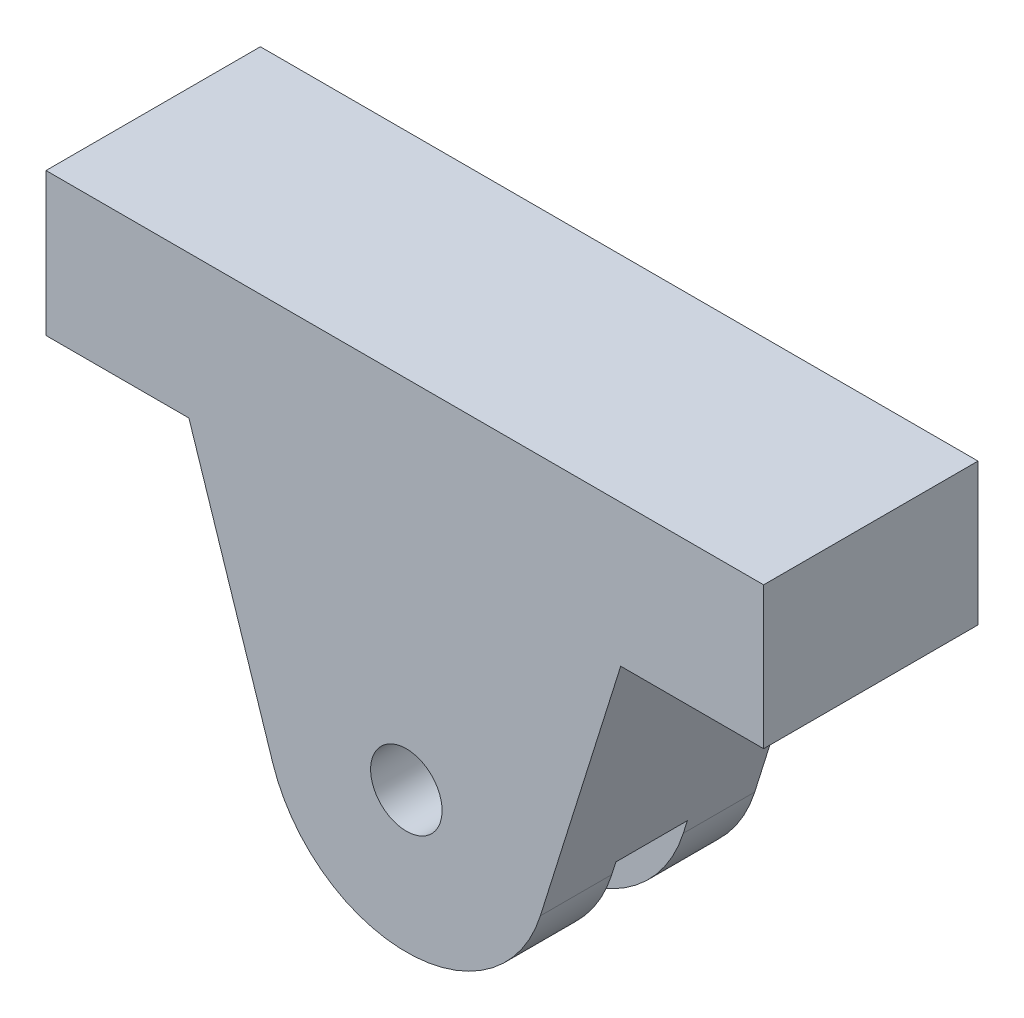
ISO-10303-21;
HEADER;
FILE_DESCRIPTION(('STEP AP214'),'2;1');
FILE_NAME('part.step','',(''),(''),'','','');
FILE_SCHEMA(('AUTOMOTIVE_DESIGN { 1 0 10303 214 1 1 1 1 }'));
ENDSEC;
DATA;
#1=APPLICATION_CONTEXT('core data for automotive mechanical design processes');
#2=APPLICATION_PROTOCOL_DEFINITION('international standard','automotive_design',2000,#1);
#3=PRODUCT_CONTEXT('',#1,'mechanical');
#4=PRODUCT('Part','Part','',(#3));
#5=PRODUCT_RELATED_PRODUCT_CATEGORY('part','',(#4));
#6=PRODUCT_DEFINITION_FORMATION('','',#4);
#7=PRODUCT_DEFINITION_CONTEXT('part definition',#1,'design');
#8=PRODUCT_DEFINITION('design','',#6,#7);
#9=PRODUCT_DEFINITION_SHAPE('','',#8);
#10=(LENGTH_UNIT() NAMED_UNIT(*) SI_UNIT(.MILLI.,.METRE.));
#11=(NAMED_UNIT(*) PLANE_ANGLE_UNIT() SI_UNIT($,.RADIAN.));
#12=(NAMED_UNIT(*) SI_UNIT($,.STERADIAN.) SOLID_ANGLE_UNIT());
#13=UNCERTAINTY_MEASURE_WITH_UNIT(LENGTH_MEASURE(1.E-05),#10,'distance_accuracy_value','');
#14=(GEOMETRIC_REPRESENTATION_CONTEXT(3) GLOBAL_UNCERTAINTY_ASSIGNED_CONTEXT((#13)) GLOBAL_UNIT_ASSIGNED_CONTEXT((#10,
#11,#12)) REPRESENTATION_CONTEXT('',''));
#15=CARTESIAN_POINT('',(0.,0.,0.));
#16=DIRECTION('',(0.,0.,1.));
#17=DIRECTION('',(1.,0.,0.));
#18=AXIS2_PLACEMENT_3D('',#15,#16,#17);
#19=CARTESIAN_POINT('',(-30.,20.,15.));
#20=DIRECTION('',(0.950602098614549,0.310412065019412,0.));
#21=DIRECTION('',(-0.310412065019412,0.950602098614549,0.));
#22=AXIS2_PLACEMENT_3D('',#19,#20,#21);
#23=PLANE('',#22);
#24=DIRECTION('',(0.310412065019412,-0.950602098614549,0.));
#25=VECTOR('',#24,1.);
#26=CARTESIAN_POINT('',(-30.,20.,-5.));
#27=LINE('',#26,#25);
#28=CARTESIAN_POINT('',(-19.1357062765585,-13.2706797747133,-5.));
#29=VERTEX_POINT('',#28);
#30=CARTESIAN_POINT('',(-18.2569796834297,-15.9616813099934,-5.));
#31=VERTEX_POINT('',#30);
#32=EDGE_CURVE('E244',#29,#31,#27,.T.);
#33=ORIENTED_EDGE('',*,*,#32,.F.);
#34=DIRECTION('',(0.,0.,1.));
#35=VECTOR('',#34,1.);
#36=CARTESIAN_POINT('',(-19.1357062765585,-13.2706797747133,15.));
#37=LINE('',#36,#35);
#38=CARTESIAN_POINT('',(-19.1357062765585,-13.2706797747133,5.));
#39=VERTEX_POINT('',#38);
#40=EDGE_CURVE('E11',#29,#39,#37,.T.);
#41=ORIENTED_EDGE('',*,*,#40,.T.);
#42=DIRECTION('',(0.310412065019412,-0.950602098614549,0.));
#43=VECTOR('',#42,1.);
#44=CARTESIAN_POINT('',(-30.,20.,5.));
#45=LINE('',#44,#43);
#46=CARTESIAN_POINT('',(-18.2569796834297,-15.9616813099934,5.));
#47=VERTEX_POINT('',#46);
#48=EDGE_CURVE('E192',#39,#47,#45,.T.);
#49=ORIENTED_EDGE('',*,*,#48,.T.);
#50=DIRECTION('',(0.,0.,-1.));
#51=VECTOR('',#50,1.);
#52=CARTESIAN_POINT('',(-18.2569796834297,-15.9616813099934,15.));
#53=LINE('',#52,#51);
#54=CARTESIAN_POINT('',(-18.2569796834297,-15.9616813099934,15.));
#55=VERTEX_POINT('',#54);
#56=EDGE_CURVE('E176',#55,#47,#53,.T.);
#57=ORIENTED_EDGE('',*,*,#56,.F.);
#58=DIRECTION('',(0.310412065019412,-0.950602098614549,0.));
#59=VECTOR('',#58,1.);
#60=CARTESIAN_POINT('',(-30.,20.,15.));
#61=LINE('',#60,#59);
#62=CARTESIAN_POINT('',(-30.,20.,15.));
#63=VERTEX_POINT('',#62);
#64=EDGE_CURVE('E254',#63,#55,#61,.T.);
#65=ORIENTED_EDGE('',*,*,#64,.F.);
#66=DIRECTION('',(0.,0.,-1.));
#67=VECTOR('',#66,1.);
#68=CARTESIAN_POINT('',(-30.,20.,15.));
#69=LINE('',#68,#67);
#70=CARTESIAN_POINT('',(-30.,20.,-15.));
#71=VERTEX_POINT('',#70);
#72=EDGE_CURVE('E179',#63,#71,#69,.T.);
#73=ORIENTED_EDGE('',*,*,#72,.T.);
#74=DIRECTION('',(0.310412065019412,-0.950602098614549,0.));
#75=VECTOR('',#74,1.);
#76=CARTESIAN_POINT('',(-30.,20.,-15.));
#77=LINE('',#76,#75);
#78=CARTESIAN_POINT('',(-18.2569796834297,-15.9616813099934,-15.));
#79=VERTEX_POINT('',#78);
#80=EDGE_CURVE('E155',#71,#79,#77,.T.);
#81=ORIENTED_EDGE('',*,*,#80,.T.);
#82=EDGE_CURVE('E175',#31,#79,#53,.T.);
#83=ORIENTED_EDGE('',*,*,#82,.F.);
#84=EDGE_LOOP('',(#33,#41,#49,#57,#65,#73,#81,#83));
#85=FACE_BOUND('',#84,.T.);
#86=ADVANCED_FACE('F39',(#85),#23,.F.);
#87=CARTESIAN_POINT('',(0.426111358182474,-9.86085649630437,15.));
#88=DIRECTION('',(0.,0.,-1.));
#89=DIRECTION('',(-1.,0.,0.));
#90=AXIS2_PLACEMENT_3D('',#87,#88,#89);
#91=CYLINDRICAL_SURFACE('',#90,19.653955181502);
#92=CARTESIAN_POINT('',(0.426111358182474,-9.86085649630437,-5.));
#93=DIRECTION('',(0.,0.,1.));
#94=DIRECTION('',(1.,0.,0.));
#95=AXIS2_PLACEMENT_3D('',#92,#93,#94);
#96=CIRCLE('',#95,19.653955181502);
#97=CARTESIAN_POINT('',(19.1803905159256,-15.7392038448311,-5.));
#98=VERTEX_POINT('',#97);
#99=EDGE_CURVE('E241',#31,#98,#96,.T.);
#100=ORIENTED_EDGE('',*,*,#99,.F.);
#101=ORIENTED_EDGE('',*,*,#82,.T.);
#102=CARTESIAN_POINT('',(0.426111358182474,-9.86085649630437,-15.));
#103=DIRECTION('',(0.,0.,1.));
#104=DIRECTION('',(1.,0.,0.));
#105=AXIS2_PLACEMENT_3D('',#102,#103,#104);
#106=CIRCLE('',#105,19.653955181502);
#107=CARTESIAN_POINT('',(19.1803905159256,-15.7392038448311,-15.));
#108=VERTEX_POINT('',#107);
#109=EDGE_CURVE('E158',#79,#108,#106,.T.);
#110=ORIENTED_EDGE('',*,*,#109,.T.);
#111=DIRECTION('',(0.,0.,-1.));
#112=VECTOR('',#111,1.);
#113=CARTESIAN_POINT('',(19.1803905159256,-15.7392038448311,15.));
#114=LINE('',#113,#112);
#115=EDGE_CURVE('E171',#98,#108,#114,.T.);
#116=ORIENTED_EDGE('',*,*,#115,.F.);
#117=EDGE_LOOP('',(#100,#101,#110,#116));
#118=FACE_BOUND('',#117,.T.);
#119=ADVANCED_FACE('F292',(#118),#91,.T.);
#120=CARTESIAN_POINT('',(30.4261113581825,20.1391435036956,15.));
#121=DIRECTION('',(-0.954224174449851,0.299092335066449,0.));
#122=DIRECTION('',(-0.299092335066449,-0.954224174449851,0.));
#123=AXIS2_PLACEMENT_3D('',#120,#121,#122);
#124=PLANE('',#123);
#125=DIRECTION('',(0.299092335066449,0.954224174449851,0.));
#126=VECTOR('',#125,1.);
#127=CARTESIAN_POINT('',(30.4261113581825,20.1391435036956,-5.));
#128=LINE('',#127,#126);
#129=CARTESIAN_POINT('',(19.7490598086974,-13.9249213547446,-5.));
#130=VERTEX_POINT('',#129);
#131=EDGE_CURVE('E191',#98,#130,#128,.T.);
#132=ORIENTED_EDGE('',*,*,#131,.F.);
#133=ORIENTED_EDGE('',*,*,#115,.T.);
#134=DIRECTION('',(0.299092335066449,0.954224174449851,0.));
#135=VECTOR('',#134,1.);
#136=CARTESIAN_POINT('',(30.4261113581825,20.1391435036956,-15.));
#137=LINE('',#136,#135);
#138=CARTESIAN_POINT('',(30.4261113581825,20.1391435036956,-15.));
#139=VERTEX_POINT('',#138);
#140=EDGE_CURVE('E161',#108,#139,#137,.T.);
#141=ORIENTED_EDGE('',*,*,#140,.T.);
#142=DIRECTION('',(0.,0.,-1.));
#143=VECTOR('',#142,1.);
#144=CARTESIAN_POINT('',(30.4261113581825,20.1391435036956,15.));
#145=LINE('',#144,#143);
#146=CARTESIAN_POINT('',(30.4261113581825,20.1391435036956,15.));
#147=VERTEX_POINT('',#146);
#148=EDGE_CURVE('E140',#147,#139,#145,.T.);
#149=ORIENTED_EDGE('',*,*,#148,.F.);
#150=DIRECTION('',(0.299092335066449,0.954224174449851,0.));
#151=VECTOR('',#150,1.);
#152=CARTESIAN_POINT('',(30.4261113581825,20.1391435036956,15.));
#153=LINE('',#152,#151);
#154=CARTESIAN_POINT('',(19.1803905159256,-15.7392038448311,15.));
#155=VERTEX_POINT('',#154);
#156=EDGE_CURVE('E128',#155,#147,#153,.T.);
#157=ORIENTED_EDGE('',*,*,#156,.F.);
#158=CARTESIAN_POINT('',(19.1803905159256,-15.7392038448311,5.));
#159=VERTEX_POINT('',#158);
#160=EDGE_CURVE('E172',#155,#159,#114,.T.);
#161=ORIENTED_EDGE('',*,*,#160,.T.);
#162=DIRECTION('',(0.299092335066449,0.954224174449851,0.));
#163=VECTOR('',#162,1.);
#164=CARTESIAN_POINT('',(30.4261113581825,20.1391435036956,5.));
#165=LINE('',#164,#163);
#166=CARTESIAN_POINT('',(19.7490598086974,-13.9249213547446,5.));
#167=VERTEX_POINT('',#166);
#168=EDGE_CURVE('E187',#159,#167,#165,.T.);
#169=ORIENTED_EDGE('',*,*,#168,.T.);
#170=DIRECTION('',(0.,0.,-1.));
#171=VECTOR('',#170,1.);
#172=CARTESIAN_POINT('',(19.7490598086974,-13.9249213547446,15.));
#173=LINE('',#172,#171);
#174=EDGE_CURVE('E47',#167,#130,#173,.T.);
#175=ORIENTED_EDGE('',*,*,#174,.T.);
#176=EDGE_LOOP('',(#132,#133,#141,#149,#157,#161,#169,#175));
#177=FACE_BOUND('',#176,.T.);
#178=ADVANCED_FACE('F198',(#177),#124,.F.);
#179=CARTESIAN_POINT('',(0.426111358182474,-9.86085649630437,15.));
#180=DIRECTION('',(0.,0.,-1.));
#181=DIRECTION('',(-1.,0.,0.));
#182=AXIS2_PLACEMENT_3D('',#179,#180,#181);
#183=CYLINDRICAL_SURFACE('',#182,5.);
#184=CARTESIAN_POINT('',(0.426111358182474,-9.86085649630437,-15.));
#185=DIRECTION('',(0.,0.,1.));
#186=DIRECTION('',(1.,0.,0.));
#187=AXIS2_PLACEMENT_3D('',#184,#185,#186);
#188=CIRCLE('',#187,5.);
#189=CARTESIAN_POINT('',(5.42611135818247,-9.86085649630437,-15.));
#190=VERTEX_POINT('',#189);
#191=EDGE_CURVE('E247',#190,#190,#188,.T.);
#192=ORIENTED_EDGE('',*,*,#191,.F.);
#193=EDGE_LOOP('',(#192));
#194=FACE_BOUND('',#193,.T.);
#195=CARTESIAN_POINT('',(0.426111358182474,-9.86085649630437,-5.));
#196=DIRECTION('',(0.,0.,1.));
#197=DIRECTION('',(1.,0.,0.));
#198=AXIS2_PLACEMENT_3D('',#195,#196,#197);
#199=CIRCLE('',#198,5.);
#200=CARTESIAN_POINT('',(5.42611135818247,-9.86085649630437,-5.));
#201=VERTEX_POINT('',#200);
#202=EDGE_CURVE('E189',#201,#201,#199,.T.);
#203=ORIENTED_EDGE('',*,*,#202,.T.);
#204=EDGE_LOOP('',(#203));
#205=FACE_BOUND('',#204,.T.);
#206=ADVANCED_FACE('F299',(#194,#205),#183,.F.);
#207=CARTESIAN_POINT('',(0.426111358182474,-9.86085649630437,15.));
#208=DIRECTION('',(0.,0.,1.));
#209=DIRECTION('',(1.,0.,0.));
#210=AXIS2_PLACEMENT_3D('',#207,#208,#209);
#211=PLANE('',#210);
#212=DIRECTION('',(0.,-1.,0.));
#213=VECTOR('',#212,1.);
#214=CARTESIAN_POINT('',(-50.,40.,15.));
#215=LINE('',#214,#213);
#216=CARTESIAN_POINT('',(-50.,40.,15.));
#217=VERTEX_POINT('',#216);
#218=CARTESIAN_POINT('',(-50.,20.,15.));
#219=VERTEX_POINT('',#218);
#220=EDGE_CURVE('E167',#217,#219,#215,.T.);
#221=ORIENTED_EDGE('',*,*,#220,.T.);
#222=DIRECTION('',(1.,0.,0.));
#223=VECTOR('',#222,1.);
#224=CARTESIAN_POINT('',(-50.,20.,15.));
#225=LINE('',#224,#223);
#226=EDGE_CURVE('E105',#219,#63,#225,.T.);
#227=ORIENTED_EDGE('',*,*,#226,.T.);
#228=ORIENTED_EDGE('',*,*,#64,.T.);
#229=CARTESIAN_POINT('',(0.426111358182474,-9.86085649630437,15.));
#230=DIRECTION('',(0.,0.,1.));
#231=DIRECTION('',(1.,0.,0.));
#232=AXIS2_PLACEMENT_3D('',#229,#230,#231);
#233=CIRCLE('',#232,19.653955181502);
#234=EDGE_CURVE('E256',#55,#155,#233,.T.);
#235=ORIENTED_EDGE('',*,*,#234,.T.);
#236=ORIENTED_EDGE('',*,*,#156,.T.);
#237=DIRECTION('',(1.,0.,0.));
#238=VECTOR('',#237,1.);
#239=CARTESIAN_POINT('',(50.4261113581825,20.1391435036956,15.));
#240=LINE('',#239,#238);
#241=CARTESIAN_POINT('',(50.4261113581825,20.1391435036956,15.));
#242=VERTEX_POINT('',#241);
#243=EDGE_CURVE('E120',#147,#242,#240,.T.);
#244=ORIENTED_EDGE('',*,*,#243,.T.);
#245=DIRECTION('',(0.,1.,0.));
#246=VECTOR('',#245,1.);
#247=CARTESIAN_POINT('',(50.4261113581825,40.,15.));
#248=LINE('',#247,#246);
#249=CARTESIAN_POINT('',(50.4261113581825,40.,15.));
#250=VERTEX_POINT('',#249);
#251=EDGE_CURVE('E125',#242,#250,#248,.T.);
#252=ORIENTED_EDGE('',*,*,#251,.T.);
#253=DIRECTION('',(-1.,0.,0.));
#254=VECTOR('',#253,1.);
#255=CARTESIAN_POINT('',(-50.,40.,15.));
#256=LINE('',#255,#254);
#257=EDGE_CURVE('E63',#250,#217,#256,.T.);
#258=ORIENTED_EDGE('',*,*,#257,.T.);
#259=EDGE_LOOP('',(#221,#227,#228,#235,#236,#244,#252,#258));
#260=FACE_BOUND('',#259,.T.);
#261=CARTESIAN_POINT('',(0.426111358182474,-9.86085649630437,15.));
#262=DIRECTION('',(0.,0.,1.));
#263=DIRECTION('',(1.,0.,0.));
#264=AXIS2_PLACEMENT_3D('',#261,#262,#263);
#265=CIRCLE('',#264,5.);
#266=CARTESIAN_POINT('',(5.42611135818247,-9.86085649630437,15.));
#267=VERTEX_POINT('',#266);
#268=EDGE_CURVE('E153',#267,#267,#265,.T.);
#269=ORIENTED_EDGE('',*,*,#268,.F.);
#270=EDGE_LOOP('',(#269));
#271=FACE_BOUND('',#270,.T.);
#272=ADVANCED_FACE('F122',(#260,#271),#211,.T.);
#273=CARTESIAN_POINT('',(0.426111358182474,-9.86085649630437,-15.));
#274=DIRECTION('',(0.,0.,1.));
#275=DIRECTION('',(1.,0.,0.));
#276=AXIS2_PLACEMENT_3D('',#273,#274,#275);
#277=PLANE('',#276);
#278=DIRECTION('',(0.,-1.,0.));
#279=VECTOR('',#278,1.);
#280=CARTESIAN_POINT('',(-50.,40.,-15.));
#281=LINE('',#280,#279);
#282=CARTESIAN_POINT('',(-50.,40.,-15.));
#283=VERTEX_POINT('',#282);
#284=CARTESIAN_POINT('',(-50.,20.,-15.));
#285=VERTEX_POINT('',#284);
#286=EDGE_CURVE('E149',#283,#285,#281,.T.);
#287=ORIENTED_EDGE('',*,*,#286,.F.);
#288=DIRECTION('',(-1.,0.,0.));
#289=VECTOR('',#288,1.);
#290=CARTESIAN_POINT('',(-50.,40.,-15.));
#291=LINE('',#290,#289);
#292=CARTESIAN_POINT('',(50.4261113581825,40.,-15.));
#293=VERTEX_POINT('',#292);
#294=EDGE_CURVE('E96',#293,#283,#291,.T.);
#295=ORIENTED_EDGE('',*,*,#294,.F.);
#296=DIRECTION('',(0.,1.,0.));
#297=VECTOR('',#296,1.);
#298=CARTESIAN_POINT('',(50.4261113581825,40.,-15.));
#299=LINE('',#298,#297);
#300=CARTESIAN_POINT('',(50.4261113581825,20.1391435036956,-15.));
#301=VERTEX_POINT('',#300);
#302=EDGE_CURVE('E164',#301,#293,#299,.T.);
#303=ORIENTED_EDGE('',*,*,#302,.F.);
#304=DIRECTION('',(1.,0.,0.));
#305=VECTOR('',#304,1.);
#306=CARTESIAN_POINT('',(50.4261113581825,20.1391435036956,-15.));
#307=LINE('',#306,#305);
#308=EDGE_CURVE('E137',#139,#301,#307,.T.);
#309=ORIENTED_EDGE('',*,*,#308,.F.);
#310=ORIENTED_EDGE('',*,*,#140,.F.);
#311=ORIENTED_EDGE('',*,*,#109,.F.);
#312=ORIENTED_EDGE('',*,*,#80,.F.);
#313=DIRECTION('',(1.,0.,0.));
#314=VECTOR('',#313,1.);
#315=CARTESIAN_POINT('',(-50.,20.,-15.));
#316=LINE('',#315,#314);
#317=EDGE_CURVE('E152',#285,#71,#316,.T.);
#318=ORIENTED_EDGE('',*,*,#317,.F.);
#319=EDGE_LOOP('',(#287,#295,#303,#309,#310,#311,#312,#318));
#320=FACE_BOUND('',#319,.T.);
#321=ORIENTED_EDGE('',*,*,#191,.T.);
#322=EDGE_LOOP('',(#321));
#323=FACE_BOUND('',#322,.T.);
#324=ADVANCED_FACE('F268',(#320,#323),#277,.F.);
#325=CARTESIAN_POINT('',(-50.,40.,15.));
#326=DIRECTION('',(1.,0.,0.));
#327=DIRECTION('',(0.,1.,0.));
#328=AXIS2_PLACEMENT_3D('',#325,#326,#327);
#329=PLANE('',#328);
#330=ORIENTED_EDGE('',*,*,#286,.T.);
#331=DIRECTION('',(0.,0.,-1.));
#332=VECTOR('',#331,1.);
#333=CARTESIAN_POINT('',(-50.,20.,15.));
#334=LINE('',#333,#332);
#335=EDGE_CURVE('E182',#219,#285,#334,.T.);
#336=ORIENTED_EDGE('',*,*,#335,.F.);
#337=ORIENTED_EDGE('',*,*,#220,.F.);
#338=DIRECTION('',(0.,0.,-1.));
#339=VECTOR('',#338,1.);
#340=CARTESIAN_POINT('',(-50.,40.,15.));
#341=LINE('',#340,#339);
#342=EDGE_CURVE('E145',#217,#283,#341,.T.);
#343=ORIENTED_EDGE('',*,*,#342,.T.);
#344=EDGE_LOOP('',(#330,#336,#337,#343));
#345=FACE_BOUND('',#344,.T.);
#346=ADVANCED_FACE('F41',(#345),#329,.F.);
#347=CARTESIAN_POINT('',(-50.,20.,15.));
#348=DIRECTION('',(0.,1.,0.));
#349=DIRECTION('',(0.,0.,1.));
#350=AXIS2_PLACEMENT_3D('',#347,#348,#349);
#351=PLANE('',#350);
#352=ORIENTED_EDGE('',*,*,#317,.T.);
#353=ORIENTED_EDGE('',*,*,#72,.F.);
#354=ORIENTED_EDGE('',*,*,#226,.F.);
#355=ORIENTED_EDGE('',*,*,#335,.T.);
#356=EDGE_LOOP('',(#352,#353,#354,#355));
#357=FACE_BOUND('',#356,.T.);
#358=ADVANCED_FACE('F275',(#357),#351,.F.);
#359=ORIENTED_EDGE('',*,*,#56,.T.);
#360=CARTESIAN_POINT('',(0.426111358182474,-9.86085649630437,5.));
#361=DIRECTION('',(0.,0.,1.));
#362=DIRECTION('',(1.,0.,0.));
#363=AXIS2_PLACEMENT_3D('',#360,#361,#362);
#364=CIRCLE('',#363,19.653955181502);
#365=EDGE_CURVE('E235',#47,#159,#364,.T.);
#366=ORIENTED_EDGE('',*,*,#365,.T.);
#367=ORIENTED_EDGE('',*,*,#160,.F.);
#368=ORIENTED_EDGE('',*,*,#234,.F.);
#369=EDGE_LOOP('',(#359,#366,#367,#368));
#370=FACE_BOUND('',#369,.T.);
#371=ADVANCED_FACE('F262',(#370),#91,.T.);
#372=CARTESIAN_POINT('',(50.4261113581825,20.1391435036956,15.));
#373=DIRECTION('',(0.,1.,0.));
#374=DIRECTION('',(-1.,0.,0.));
#375=AXIS2_PLACEMENT_3D('',#372,#373,#374);
#376=PLANE('',#375);
#377=ORIENTED_EDGE('',*,*,#308,.T.);
#378=DIRECTION('',(0.,0.,-1.));
#379=VECTOR('',#378,1.);
#380=CARTESIAN_POINT('',(50.4261113581825,20.1391435036956,15.));
#381=LINE('',#380,#379);
#382=EDGE_CURVE('E134',#242,#301,#381,.T.);
#383=ORIENTED_EDGE('',*,*,#382,.F.);
#384=ORIENTED_EDGE('',*,*,#243,.F.);
#385=ORIENTED_EDGE('',*,*,#148,.T.);
#386=EDGE_LOOP('',(#377,#383,#384,#385));
#387=FACE_BOUND('',#386,.T.);
#388=ADVANCED_FACE('F135',(#387),#376,.F.);
#389=CARTESIAN_POINT('',(50.4261113581825,40.,15.));
#390=DIRECTION('',(-1.,0.,0.));
#391=DIRECTION('',(0.,0.,1.));
#392=AXIS2_PLACEMENT_3D('',#389,#390,#391);
#393=PLANE('',#392);
#394=ORIENTED_EDGE('',*,*,#302,.T.);
#395=DIRECTION('',(0.,0.,-1.));
#396=VECTOR('',#395,1.);
#397=CARTESIAN_POINT('',(50.4261113581825,40.,15.));
#398=LINE('',#397,#396);
#399=EDGE_CURVE('E141',#250,#293,#398,.T.);
#400=ORIENTED_EDGE('',*,*,#399,.F.);
#401=ORIENTED_EDGE('',*,*,#251,.F.);
#402=ORIENTED_EDGE('',*,*,#382,.T.);
#403=EDGE_LOOP('',(#394,#400,#401,#402));
#404=FACE_BOUND('',#403,.T.);
#405=ADVANCED_FACE('F143',(#404),#393,.F.);
#406=CARTESIAN_POINT('',(-50.,40.,15.));
#407=DIRECTION('',(0.,-1.,0.));
#408=DIRECTION('',(0.,0.,-1.));
#409=AXIS2_PLACEMENT_3D('',#406,#407,#408);
#410=PLANE('',#409);
#411=ORIENTED_EDGE('',*,*,#294,.T.);
#412=ORIENTED_EDGE('',*,*,#342,.F.);
#413=ORIENTED_EDGE('',*,*,#257,.F.);
#414=ORIENTED_EDGE('',*,*,#399,.T.);
#415=EDGE_LOOP('',(#411,#412,#413,#414));
#416=FACE_BOUND('',#415,.T.);
#417=ADVANCED_FACE('F271',(#416),#410,.F.);
#418=CARTESIAN_POINT('',(0.426111358182474,-9.86085649630437,5.));
#419=DIRECTION('',(0.,0.,1.));
#420=DIRECTION('',(1.,0.,0.));
#421=AXIS2_PLACEMENT_3D('',#418,#419,#420);
#422=CIRCLE('',#421,5.);
#423=CARTESIAN_POINT('',(5.42611135818247,-9.86085649630437,5.));
#424=VERTEX_POINT('',#423);
#425=EDGE_CURVE('E184',#424,#424,#422,.T.);
#426=ORIENTED_EDGE('',*,*,#425,.F.);
#427=EDGE_LOOP('',(#426));
#428=FACE_BOUND('',#427,.T.);
#429=ORIENTED_EDGE('',*,*,#268,.T.);
#430=EDGE_LOOP('',(#429));
#431=FACE_BOUND('',#430,.T.);
#432=ADVANCED_FACE('F323',(#428,#431),#183,.F.);
#433=CARTESIAN_POINT('',(-50.1483655247345,-40.,-5.));
#434=DIRECTION('',(-0.652859318904689,0.757479181046784,0.));
#435=DIRECTION('',(-0.757479181046784,-0.652859318904689,0.));
#436=AXIS2_PLACEMENT_3D('',#433,#434,#435);
#437=PLANE('',#436);
#438=DIRECTION('',(-0.757479181046784,-0.652859318904689,0.));
#439=VECTOR('',#438,1.);
#440=CARTESIAN_POINT('',(-50.1483655247345,-40.,-5.));
#441=LINE('',#440,#439);
#442=CARTESIAN_POINT('',(-6.60088740635493,-2.46711775616945,-5.));
#443=VERTEX_POINT('',#442);
#444=EDGE_CURVE('E218',#443,#29,#441,.T.);
#445=ORIENTED_EDGE('',*,*,#444,.F.);
#446=DIRECTION('',(0.,0.,1.));
#447=VECTOR('',#446,1.);
#448=CARTESIAN_POINT('',(-6.60088740635493,-2.46711775616945,-5.));
#449=LINE('',#448,#447);
#450=CARTESIAN_POINT('',(-6.60088740635493,-2.46711775616945,5.));
#451=VERTEX_POINT('',#450);
#452=EDGE_CURVE('E188',#443,#451,#449,.T.);
#453=ORIENTED_EDGE('',*,*,#452,.T.);
#454=DIRECTION('',(-0.757479181046784,-0.652859318904689,0.));
#455=VECTOR('',#454,1.);
#456=CARTESIAN_POINT('',(-50.1483655247345,-40.,5.));
#457=LINE('',#456,#455);
#458=EDGE_CURVE('E225',#451,#39,#457,.T.);
#459=ORIENTED_EDGE('',*,*,#458,.T.);
#460=ORIENTED_EDGE('',*,*,#40,.F.);
#461=EDGE_LOOP('',(#445,#453,#459,#460));
#462=FACE_BOUND('',#461,.T.);
#463=ADVANCED_FACE('F340',(#462),#437,.F.);
#464=CARTESIAN_POINT('',(50.0000394920625,-40.,-5.));
#465=DIRECTION('',(0.652891470730601,0.757451468707556,0.));
#466=DIRECTION('',(-0.757451468707556,0.652891470730601,0.));
#467=AXIS2_PLACEMENT_3D('',#464,#465,#466);
#468=PLANE('',#467);
#469=DIRECTION('',(-0.757451468707556,0.652891470730601,0.));
#470=VECTOR('',#469,1.);
#471=CARTESIAN_POINT('',(50.0000394920625,-40.,5.));
#472=LINE('',#471,#470);
#473=CARTESIAN_POINT('',(6.45662048999797,-2.46739487956173,5.));
#474=VERTEX_POINT('',#473);
#475=EDGE_CURVE('E54',#167,#474,#472,.T.);
#476=ORIENTED_EDGE('',*,*,#475,.T.);
#477=DIRECTION('',(0.,0.,1.));
#478=VECTOR('',#477,1.);
#479=CARTESIAN_POINT('',(6.45662048999797,-2.46739487956173,-5.));
#480=LINE('',#479,#478);
#481=CARTESIAN_POINT('',(6.45662048999797,-2.46739487956173,-5.));
#482=VERTEX_POINT('',#481);
#483=EDGE_CURVE('E213',#482,#474,#480,.T.);
#484=ORIENTED_EDGE('',*,*,#483,.F.);
#485=DIRECTION('',(-0.757451468707556,0.652891470730601,0.));
#486=VECTOR('',#485,1.);
#487=CARTESIAN_POINT('',(50.0000394920625,-40.,-5.));
#488=LINE('',#487,#486);
#489=EDGE_CURVE('E211',#130,#482,#488,.T.);
#490=ORIENTED_EDGE('',*,*,#489,.F.);
#491=ORIENTED_EDGE('',*,*,#174,.F.);
#492=EDGE_LOOP('',(#476,#484,#490,#491));
#493=FACE_BOUND('',#492,.T.);
#494=ADVANCED_FACE('F206',(#493),#468,.F.);
#495=CARTESIAN_POINT('',(-0.0722942173080423,-10.0419095666373,-5.));
#496=DIRECTION('',(0.,0.,1.));
#497=DIRECTION('',(1.,0.,0.));
#498=AXIS2_PLACEMENT_3D('',#495,#496,#497);
#499=PLANE('',#498);
#500=ORIENTED_EDGE('',*,*,#202,.F.);
#501=EDGE_LOOP('',(#500));
#502=FACE_BOUND('',#501,.T.);
#503=ORIENTED_EDGE('',*,*,#32,.T.);
#504=ORIENTED_EDGE('',*,*,#99,.T.);
#505=ORIENTED_EDGE('',*,*,#131,.T.);
#506=ORIENTED_EDGE('',*,*,#489,.T.);
#507=CARTESIAN_POINT('',(-0.0722942173080423,-10.0419095666373,-5.));
#508=DIRECTION('',(0.,0.,1.));
#509=DIRECTION('',(1.,0.,0.));
#510=AXIS2_PLACEMENT_3D('',#507,#508,#509);
#511=CIRCLE('',#510,10.);
#512=EDGE_CURVE('E217',#482,#443,#511,.T.);
#513=ORIENTED_EDGE('',*,*,#512,.T.);
#514=ORIENTED_EDGE('',*,*,#444,.T.);
#515=EDGE_LOOP('',(#503,#504,#505,#506,#513,#514));
#516=FACE_BOUND('',#515,.T.);
#517=ADVANCED_FACE('F288',(#502,#516),#499,.T.);
#518=CARTESIAN_POINT('',(-0.0722942173080423,-10.0419095666373,5.));
#519=DIRECTION('',(0.,0.,1.));
#520=DIRECTION('',(1.,0.,0.));
#521=AXIS2_PLACEMENT_3D('',#518,#519,#520);
#522=PLANE('',#521);
#523=ORIENTED_EDGE('',*,*,#425,.T.);
#524=EDGE_LOOP('',(#523));
#525=FACE_BOUND('',#524,.T.);
#526=ORIENTED_EDGE('',*,*,#458,.F.);
#527=CARTESIAN_POINT('',(-0.0722942173080423,-10.0419095666373,5.));
#528=DIRECTION('',(0.,0.,1.));
#529=DIRECTION('',(1.,0.,0.));
#530=AXIS2_PLACEMENT_3D('',#527,#528,#529);
#531=CIRCLE('',#530,10.);
#532=EDGE_CURVE('E222',#474,#451,#531,.T.);
#533=ORIENTED_EDGE('',*,*,#532,.F.);
#534=ORIENTED_EDGE('',*,*,#475,.F.);
#535=ORIENTED_EDGE('',*,*,#168,.F.);
#536=ORIENTED_EDGE('',*,*,#365,.F.);
#537=ORIENTED_EDGE('',*,*,#48,.F.);
#538=EDGE_LOOP('',(#526,#533,#534,#535,#536,#537));
#539=FACE_BOUND('',#538,.T.);
#540=ADVANCED_FACE('F360',(#525,#539),#522,.F.);
#541=CARTESIAN_POINT('',(-0.0722942173080423,-10.0419095666373,-5.));
#542=DIRECTION('',(0.,0.,1.));
#543=DIRECTION('',(1.,0.,0.));
#544=AXIS2_PLACEMENT_3D('',#541,#542,#543);
#545=CYLINDRICAL_SURFACE('',#544,10.);
#546=ORIENTED_EDGE('',*,*,#532,.T.);
#547=ORIENTED_EDGE('',*,*,#452,.F.);
#548=ORIENTED_EDGE('',*,*,#512,.F.);
#549=ORIENTED_EDGE('',*,*,#483,.T.);
#550=EDGE_LOOP('',(#546,#547,#548,#549));
#551=FACE_BOUND('',#550,.T.);
#552=ADVANCED_FACE('F368',(#551),#545,.F.);
#553=CLOSED_SHELL('',(#86,#119,#178,#206,#272,#324,#346,#358,#371,#388,#405,#417,#432,#463,#494,
#517,#540,#552));
#554=MANIFOLD_SOLID_BREP('B2',#553);
#555=ADVANCED_BREP_SHAPE_REPRESENTATION('',(#18,#554),#14);
#556=SHAPE_DEFINITION_REPRESENTATION(#9,#555);
ENDSEC;
END-ISO-10303-21;
